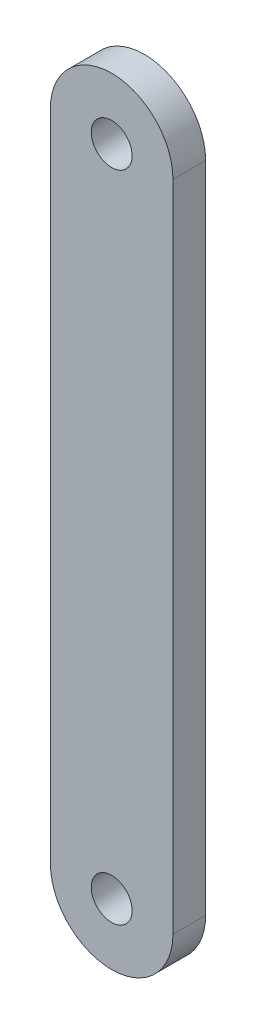
ISO-10303-21;
HEADER;
FILE_DESCRIPTION(('STEP AP214'),'2;1');
FILE_NAME('part.step','',(''),(''),'','','');
FILE_SCHEMA(('AUTOMOTIVE_DESIGN { 1 0 10303 214 1 1 1 1 }'));
ENDSEC;
DATA;
#1=APPLICATION_CONTEXT('core data for automotive mechanical design processes');
#2=APPLICATION_PROTOCOL_DEFINITION('international standard','automotive_design',2000,#1);
#3=PRODUCT_CONTEXT('',#1,'mechanical');
#4=PRODUCT('Part','Part','',(#3));
#5=PRODUCT_RELATED_PRODUCT_CATEGORY('part','',(#4));
#6=PRODUCT_DEFINITION_FORMATION('','',#4);
#7=PRODUCT_DEFINITION_CONTEXT('part definition',#1,'design');
#8=PRODUCT_DEFINITION('design','',#6,#7);
#9=PRODUCT_DEFINITION_SHAPE('','',#8);
#10=(LENGTH_UNIT() NAMED_UNIT(*) SI_UNIT(.MILLI.,.METRE.));
#11=(NAMED_UNIT(*) PLANE_ANGLE_UNIT() SI_UNIT($,.RADIAN.));
#12=(NAMED_UNIT(*) SI_UNIT($,.STERADIAN.) SOLID_ANGLE_UNIT());
#13=UNCERTAINTY_MEASURE_WITH_UNIT(LENGTH_MEASURE(1.E-05),#10,'distance_accuracy_value','');
#14=(GEOMETRIC_REPRESENTATION_CONTEXT(3) GLOBAL_UNCERTAINTY_ASSIGNED_CONTEXT((#13)) GLOBAL_UNIT_ASSIGNED_CONTEXT((#10,
#11,#12)) REPRESENTATION_CONTEXT('',''));
#15=CARTESIAN_POINT('',(0.,0.,0.));
#16=DIRECTION('',(0.,0.,1.));
#17=DIRECTION('',(1.,0.,0.));
#18=AXIS2_PLACEMENT_3D('',#15,#16,#17);
#19=CARTESIAN_POINT('',(0.,-25.4,2.54));
#20=DIRECTION('',(0.,0.,1.));
#21=DIRECTION('',(1.,0.,0.));
#22=AXIS2_PLACEMENT_3D('',#19,#20,#21);
#23=PLANE('',#22);
#24=CARTESIAN_POINT('',(0.,25.4,2.54));
#25=DIRECTION('',(0.,0.,1.));
#26=DIRECTION('',(1.,0.,0.));
#27=AXIS2_PLACEMENT_3D('',#24,#25,#26);
#28=CIRCLE('',#27,1.5875);
#29=CARTESIAN_POINT('',(1.58749999999999,25.4,2.54));
#30=VERTEX_POINT('',#29);
#31=EDGE_CURVE('E113',#30,#30,#28,.T.);
#32=ORIENTED_EDGE('',*,*,#31,.F.);
#33=EDGE_LOOP('',(#32));
#34=FACE_BOUND('',#33,.T.);
#35=CARTESIAN_POINT('',(0.,-25.4,2.54));
#36=DIRECTION('',(0.,0.,1.));
#37=DIRECTION('',(1.,0.,0.));
#38=AXIS2_PLACEMENT_3D('',#35,#36,#37);
#39=CIRCLE('',#38,4.76250000000001);
#40=CARTESIAN_POINT('',(-4.76250000000001,-25.4,2.54));
#41=VERTEX_POINT('',#40);
#42=CARTESIAN_POINT('',(4.76250000000001,-25.4,2.54));
#43=VERTEX_POINT('',#42);
#44=EDGE_CURVE('E95',#41,#43,#39,.T.);
#45=ORIENTED_EDGE('',*,*,#44,.T.);
#46=DIRECTION('',(0.,1.,0.));
#47=VECTOR('',#46,1.);
#48=CARTESIAN_POINT('',(4.76250000000001,-25.4,2.54));
#49=LINE('',#48,#47);
#50=CARTESIAN_POINT('',(4.7625,25.4,2.54));
#51=VERTEX_POINT('',#50);
#52=EDGE_CURVE('E90',#43,#51,#49,.T.);
#53=ORIENTED_EDGE('',*,*,#52,.T.);
#54=CARTESIAN_POINT('',(0.,25.4,2.54));
#55=DIRECTION('',(0.,0.,1.));
#56=DIRECTION('',(1.,0.,0.));
#57=AXIS2_PLACEMENT_3D('',#54,#55,#56);
#58=CIRCLE('',#57,4.76250000000001);
#59=CARTESIAN_POINT('',(-4.76250000000002,25.4,2.54));
#60=VERTEX_POINT('',#59);
#61=EDGE_CURVE('E93',#51,#60,#58,.T.);
#62=ORIENTED_EDGE('',*,*,#61,.T.);
#63=DIRECTION('',(0.,-1.,0.));
#64=VECTOR('',#63,1.);
#65=CARTESIAN_POINT('',(-4.76250000000001,-25.4,2.54));
#66=LINE('',#65,#64);
#67=EDGE_CURVE('E58',#60,#41,#66,.T.);
#68=ORIENTED_EDGE('',*,*,#67,.T.);
#69=EDGE_LOOP('',(#45,#53,#62,#68));
#70=FACE_BOUND('',#69,.T.);
#71=CARTESIAN_POINT('',(0.,-25.4,2.54));
#72=DIRECTION('',(0.,0.,1.));
#73=DIRECTION('',(1.,0.,0.));
#74=AXIS2_PLACEMENT_3D('',#71,#72,#73);
#75=CIRCLE('',#74,1.5875);
#76=CARTESIAN_POINT('',(1.5875,-25.4,2.54));
#77=VERTEX_POINT('',#76);
#78=EDGE_CURVE('E132',#77,#77,#75,.T.);
#79=ORIENTED_EDGE('',*,*,#78,.F.);
#80=EDGE_LOOP('',(#79));
#81=FACE_BOUND('',#80,.T.);
#82=ADVANCED_FACE('F38',(#34,#70,#81),#23,.T.);
#83=CARTESIAN_POINT('',(0.,-25.4,0.));
#84=DIRECTION('',(0.,0.,1.));
#85=DIRECTION('',(1.,0.,0.));
#86=AXIS2_PLACEMENT_3D('',#83,#84,#85);
#87=PLANE('',#86);
#88=CARTESIAN_POINT('',(0.,-25.4,0.));
#89=DIRECTION('',(0.,0.,1.));
#90=DIRECTION('',(1.,0.,0.));
#91=AXIS2_PLACEMENT_3D('',#88,#89,#90);
#92=CIRCLE('',#91,4.76250000000001);
#93=CARTESIAN_POINT('',(-4.76250000000001,-25.4,0.));
#94=VERTEX_POINT('',#93);
#95=CARTESIAN_POINT('',(4.76250000000001,-25.4,0.));
#96=VERTEX_POINT('',#95);
#97=EDGE_CURVE('E109',#94,#96,#92,.T.);
#98=ORIENTED_EDGE('',*,*,#97,.F.);
#99=DIRECTION('',(0.,-1.,0.));
#100=VECTOR('',#99,1.);
#101=CARTESIAN_POINT('',(-4.76250000000001,-25.4,0.));
#102=LINE('',#101,#100);
#103=CARTESIAN_POINT('',(-4.76250000000002,25.4,0.));
#104=VERTEX_POINT('',#103);
#105=EDGE_CURVE('E83',#104,#94,#102,.T.);
#106=ORIENTED_EDGE('',*,*,#105,.F.);
#107=CARTESIAN_POINT('',(0.,25.4,0.));
#108=DIRECTION('',(0.,0.,1.));
#109=DIRECTION('',(1.,0.,0.));
#110=AXIS2_PLACEMENT_3D('',#107,#108,#109);
#111=CIRCLE('',#110,4.76250000000001);
#112=CARTESIAN_POINT('',(4.7625,25.4,0.));
#113=VERTEX_POINT('',#112);
#114=EDGE_CURVE('E76',#113,#104,#111,.T.);
#115=ORIENTED_EDGE('',*,*,#114,.F.);
#116=DIRECTION('',(0.,1.,0.));
#117=VECTOR('',#116,1.);
#118=CARTESIAN_POINT('',(4.76250000000001,-25.4,0.));
#119=LINE('',#118,#117);
#120=EDGE_CURVE('E100',#96,#113,#119,.T.);
#121=ORIENTED_EDGE('',*,*,#120,.F.);
#122=EDGE_LOOP('',(#98,#106,#115,#121));
#123=FACE_BOUND('',#122,.T.);
#124=CARTESIAN_POINT('',(0.,25.4,0.));
#125=DIRECTION('',(0.,0.,1.));
#126=DIRECTION('',(1.,0.,0.));
#127=AXIS2_PLACEMENT_3D('',#124,#125,#126);
#128=CIRCLE('',#127,1.5875);
#129=CARTESIAN_POINT('',(1.58749999999999,25.4,0.));
#130=VERTEX_POINT('',#129);
#131=EDGE_CURVE('E129',#130,#130,#128,.T.);
#132=ORIENTED_EDGE('',*,*,#131,.T.);
#133=EDGE_LOOP('',(#132));
#134=FACE_BOUND('',#133,.T.);
#135=CARTESIAN_POINT('',(0.,-25.4,0.));
#136=DIRECTION('',(0.,0.,1.));
#137=DIRECTION('',(1.,0.,0.));
#138=AXIS2_PLACEMENT_3D('',#135,#136,#137);
#139=CIRCLE('',#138,1.5875);
#140=CARTESIAN_POINT('',(1.5875,-25.4,0.));
#141=VERTEX_POINT('',#140);
#142=EDGE_CURVE('E135',#141,#141,#139,.T.);
#143=ORIENTED_EDGE('',*,*,#142,.T.);
#144=EDGE_LOOP('',(#143));
#145=FACE_BOUND('',#144,.T.);
#146=ADVANCED_FACE('F124',(#123,#134,#145),#87,.F.);
#147=CARTESIAN_POINT('',(0.,-25.4,2.54));
#148=DIRECTION('',(0.,0.,-1.));
#149=DIRECTION('',(-1.,0.,0.));
#150=AXIS2_PLACEMENT_3D('',#147,#148,#149);
#151=CYLINDRICAL_SURFACE('',#150,4.76250000000001);
#152=ORIENTED_EDGE('',*,*,#97,.T.);
#153=DIRECTION('',(0.,0.,-1.));
#154=VECTOR('',#153,1.);
#155=CARTESIAN_POINT('',(4.76250000000001,-25.4,2.54));
#156=LINE('',#155,#154);
#157=EDGE_CURVE('E11',#43,#96,#156,.T.);
#158=ORIENTED_EDGE('',*,*,#157,.F.);
#159=ORIENTED_EDGE('',*,*,#44,.F.);
#160=DIRECTION('',(0.,0.,-1.));
#161=VECTOR('',#160,1.);
#162=CARTESIAN_POINT('',(-4.76250000000001,-25.4,2.54));
#163=LINE('',#162,#161);
#164=EDGE_CURVE('E105',#41,#94,#163,.T.);
#165=ORIENTED_EDGE('',*,*,#164,.T.);
#166=EDGE_LOOP('',(#152,#158,#159,#165));
#167=FACE_BOUND('',#166,.T.);
#168=ADVANCED_FACE('F40',(#167),#151,.T.);
#169=CARTESIAN_POINT('',(4.76250000000001,-25.4,2.54));
#170=DIRECTION('',(-1.,0.,0.));
#171=DIRECTION('',(0.,-1.,0.));
#172=AXIS2_PLACEMENT_3D('',#169,#170,#171);
#173=PLANE('',#172);
#174=ORIENTED_EDGE('',*,*,#120,.T.);
#175=DIRECTION('',(0.,0.,-1.));
#176=VECTOR('',#175,1.);
#177=CARTESIAN_POINT('',(4.7625,25.4,2.54));
#178=LINE('',#177,#176);
#179=EDGE_CURVE('E48',#51,#113,#178,.T.);
#180=ORIENTED_EDGE('',*,*,#179,.F.);
#181=ORIENTED_EDGE('',*,*,#52,.F.);
#182=ORIENTED_EDGE('',*,*,#157,.T.);
#183=EDGE_LOOP('',(#174,#180,#181,#182));
#184=FACE_BOUND('',#183,.T.);
#185=ADVANCED_FACE('F99',(#184),#173,.F.);
#186=CARTESIAN_POINT('',(0.,25.4,2.54));
#187=DIRECTION('',(0.,0.,-1.));
#188=DIRECTION('',(-1.,0.,0.));
#189=AXIS2_PLACEMENT_3D('',#186,#187,#188);
#190=CYLINDRICAL_SURFACE('',#189,4.76250000000001);
#191=ORIENTED_EDGE('',*,*,#114,.T.);
#192=DIRECTION('',(0.,0.,-1.));
#193=VECTOR('',#192,1.);
#194=CARTESIAN_POINT('',(-4.76250000000002,25.4,2.54));
#195=LINE('',#194,#193);
#196=EDGE_CURVE('E101',#60,#104,#195,.T.);
#197=ORIENTED_EDGE('',*,*,#196,.F.);
#198=ORIENTED_EDGE('',*,*,#61,.F.);
#199=ORIENTED_EDGE('',*,*,#179,.T.);
#200=EDGE_LOOP('',(#191,#197,#198,#199));
#201=FACE_BOUND('',#200,.T.);
#202=ADVANCED_FACE('F102',(#201),#190,.T.);
#203=CARTESIAN_POINT('',(-4.76250000000001,-25.4,2.54));
#204=DIRECTION('',(1.,0.,0.));
#205=DIRECTION('',(0.,1.,0.));
#206=AXIS2_PLACEMENT_3D('',#203,#204,#205);
#207=PLANE('',#206);
#208=ORIENTED_EDGE('',*,*,#105,.T.);
#209=ORIENTED_EDGE('',*,*,#164,.F.);
#210=ORIENTED_EDGE('',*,*,#67,.F.);
#211=ORIENTED_EDGE('',*,*,#196,.T.);
#212=EDGE_LOOP('',(#208,#209,#210,#211));
#213=FACE_BOUND('',#212,.T.);
#214=ADVANCED_FACE('F121',(#213),#207,.F.);
#215=CARTESIAN_POINT('',(0.,25.4,2.54));
#216=DIRECTION('',(0.,0.,-1.));
#217=DIRECTION('',(-1.,0.,0.));
#218=AXIS2_PLACEMENT_3D('',#215,#216,#217);
#219=CYLINDRICAL_SURFACE('',#218,1.5875);
#220=ORIENTED_EDGE('',*,*,#31,.T.);
#221=EDGE_LOOP('',(#220));
#222=FACE_BOUND('',#221,.T.);
#223=ORIENTED_EDGE('',*,*,#131,.F.);
#224=EDGE_LOOP('',(#223));
#225=FACE_BOUND('',#224,.T.);
#226=ADVANCED_FACE('F154',(#222,#225),#219,.F.);
#227=CARTESIAN_POINT('',(0.,-25.4,2.54));
#228=DIRECTION('',(0.,0.,-1.));
#229=DIRECTION('',(-1.,0.,0.));
#230=AXIS2_PLACEMENT_3D('',#227,#228,#229);
#231=CYLINDRICAL_SURFACE('',#230,1.5875);
#232=ORIENTED_EDGE('',*,*,#78,.T.);
#233=EDGE_LOOP('',(#232));
#234=FACE_BOUND('',#233,.T.);
#235=ORIENTED_EDGE('',*,*,#142,.F.);
#236=EDGE_LOOP('',(#235));
#237=FACE_BOUND('',#236,.T.);
#238=ADVANCED_FACE('F143',(#234,#237),#231,.F.);
#239=CLOSED_SHELL('',(#82,#146,#168,#185,#202,#214,#226,#238));
#240=MANIFOLD_SOLID_BREP('B2',#239);
#241=ADVANCED_BREP_SHAPE_REPRESENTATION('',(#18,#240),#14);
#242=SHAPE_DEFINITION_REPRESENTATION(#9,#241);
ENDSEC;
END-ISO-10303-21;
